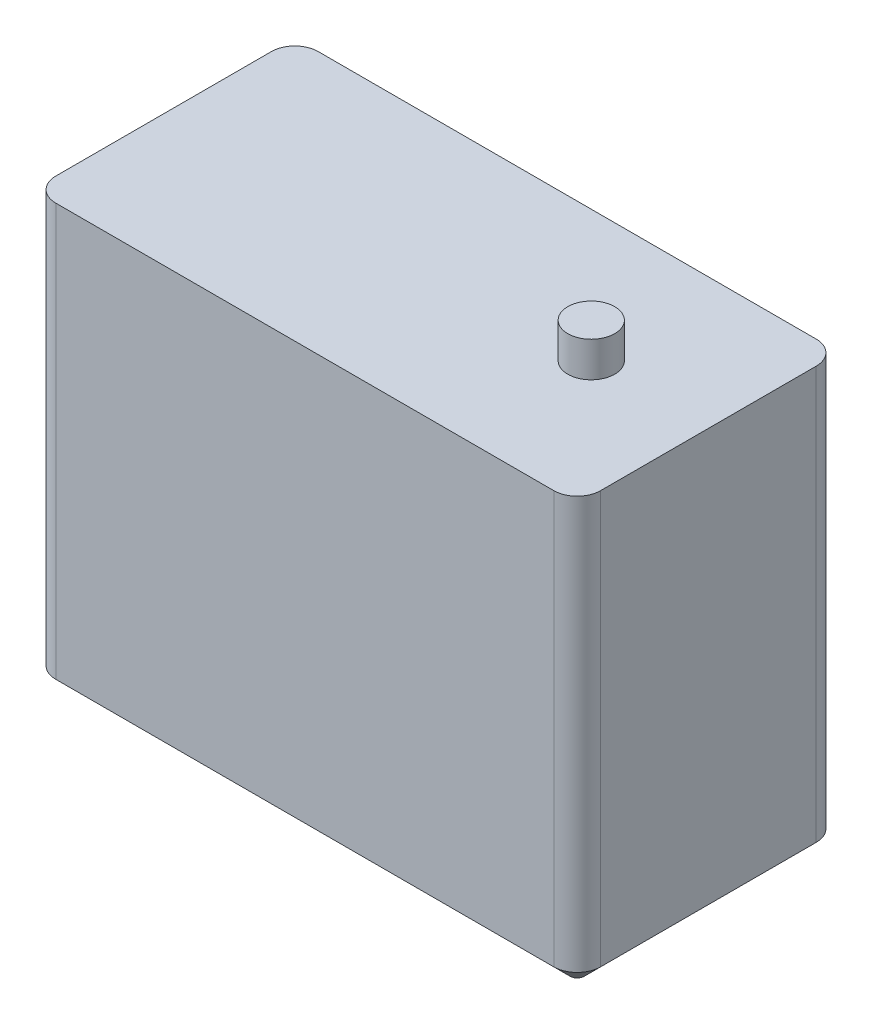
ISO-10303-21;
HEADER;
FILE_DESCRIPTION(('STEP AP214'),'2;1');
FILE_NAME('part.step','',(''),(''),'','','');
FILE_SCHEMA(('AUTOMOTIVE_DESIGN { 1 0 10303 214 1 1 1 1 }'));
ENDSEC;
DATA;
#1=APPLICATION_CONTEXT('core data for automotive mechanical design processes');
#2=APPLICATION_PROTOCOL_DEFINITION('international standard','automotive_design',2000,#1);
#3=PRODUCT_CONTEXT('',#1,'mechanical');
#4=PRODUCT('Part','Part','',(#3));
#5=PRODUCT_RELATED_PRODUCT_CATEGORY('part','',(#4));
#6=PRODUCT_DEFINITION_FORMATION('','',#4);
#7=PRODUCT_DEFINITION_CONTEXT('part definition',#1,'design');
#8=PRODUCT_DEFINITION('design','',#6,#7);
#9=PRODUCT_DEFINITION_SHAPE('','',#8);
#10=(LENGTH_UNIT() NAMED_UNIT(*) SI_UNIT(.MILLI.,.METRE.));
#11=(NAMED_UNIT(*) PLANE_ANGLE_UNIT() SI_UNIT($,.RADIAN.));
#12=(NAMED_UNIT(*) SI_UNIT($,.STERADIAN.) SOLID_ANGLE_UNIT());
#13=UNCERTAINTY_MEASURE_WITH_UNIT(LENGTH_MEASURE(1.E-05),#10,'distance_accuracy_value','');
#14=(GEOMETRIC_REPRESENTATION_CONTEXT(3) GLOBAL_UNCERTAINTY_ASSIGNED_CONTEXT((#13)) GLOBAL_UNIT_ASSIGNED_CONTEXT((#10,
#11,#12)) REPRESENTATION_CONTEXT('',''));
#15=CARTESIAN_POINT('',(0.,0.,0.));
#16=DIRECTION('',(0.,0.,1.));
#17=DIRECTION('',(1.,0.,0.));
#18=AXIS2_PLACEMENT_3D('',#15,#16,#17);
#19=CARTESIAN_POINT('',(0.,46.482,0.));
#20=DIRECTION('',(0.,-1.,0.));
#21=DIRECTION('',(0.,0.,-1.));
#22=AXIS2_PLACEMENT_3D('',#19,#20,#21);
#23=PLANE('',#22);
#24=DIRECTION('',(-1.,0.,0.));
#25=VECTOR('',#24,1.);
#26=CARTESIAN_POINT('',(-31.8715115525379,46.482,-4.46509543107518));
#27=LINE('',#26,#25);
#28=CARTESIAN_POINT('',(24.6434884474621,46.482,-4.46509543107518));
#29=VERTEX_POINT('',#28);
#30=CARTESIAN_POINT('',(-29.3315115525379,46.482,-4.46509543107518));
#31=VERTEX_POINT('',#30);
#32=EDGE_CURVE('E131',#29,#31,#27,.T.);
#33=ORIENTED_EDGE('',*,*,#32,.T.);
#34=CARTESIAN_POINT('',(-29.3315115525379,46.482,-1.92509543107518));
#35=DIRECTION('',(0.,-1.,0.));
#36=DIRECTION('',(0.,0.,-1.));
#37=AXIS2_PLACEMENT_3D('',#34,#35,#36);
#38=CIRCLE('',#37,2.54);
#39=CARTESIAN_POINT('',(-31.8715115525379,46.482,-1.92509543107518));
#40=VERTEX_POINT('',#39);
#41=EDGE_CURVE('E125',#31,#40,#38,.F.);
#42=ORIENTED_EDGE('',*,*,#41,.T.);
#43=DIRECTION('',(0.,0.,1.));
#44=VECTOR('',#43,1.);
#45=CARTESIAN_POINT('',(-31.8715115525379,46.482,23.9829045689248));
#46=LINE('',#45,#44);
#47=CARTESIAN_POINT('',(-31.8715115525379,46.482,21.4429045689248));
#48=VERTEX_POINT('',#47);
#49=EDGE_CURVE('E128',#40,#48,#46,.T.);
#50=ORIENTED_EDGE('',*,*,#49,.T.);
#51=CARTESIAN_POINT('',(-29.3315115525379,46.482,21.4429045689248));
#52=DIRECTION('',(0.,-1.,0.));
#53=DIRECTION('',(0.,0.,-1.));
#54=AXIS2_PLACEMENT_3D('',#51,#52,#53);
#55=CIRCLE('',#54,2.54);
#56=CARTESIAN_POINT('',(-29.3315115525379,46.482,23.9829045689248));
#57=VERTEX_POINT('',#56);
#58=EDGE_CURVE('E161',#48,#57,#55,.F.);
#59=ORIENTED_EDGE('',*,*,#58,.T.);
#60=DIRECTION('',(1.,0.,0.));
#61=VECTOR('',#60,1.);
#62=CARTESIAN_POINT('',(-31.8715115525379,46.482,23.9829045689248));
#63=LINE('',#62,#61);
#64=CARTESIAN_POINT('',(24.6434884474621,46.482,23.9829045689248));
#65=VERTEX_POINT('',#64);
#66=EDGE_CURVE('E144',#57,#65,#63,.T.);
#67=ORIENTED_EDGE('',*,*,#66,.T.);
#68=CARTESIAN_POINT('',(24.6434884474621,46.482,21.4429045689248));
#69=DIRECTION('',(0.,-1.,0.));
#70=DIRECTION('',(0.,0.,-1.));
#71=AXIS2_PLACEMENT_3D('',#68,#69,#70);
#72=CIRCLE('',#71,2.54);
#73=CARTESIAN_POINT('',(27.1834884474621,46.482,21.4429045689248));
#74=VERTEX_POINT('',#73);
#75=EDGE_CURVE('E163',#65,#74,#72,.F.);
#76=ORIENTED_EDGE('',*,*,#75,.T.);
#77=DIRECTION('',(0.,0.,-1.));
#78=VECTOR('',#77,1.);
#79=CARTESIAN_POINT('',(27.1834884474621,46.482,23.9829045689248));
#80=LINE('',#79,#78);
#81=CARTESIAN_POINT('',(27.1834884474621,46.482,-1.92509543107518));
#82=VERTEX_POINT('',#81);
#83=EDGE_CURVE('E233',#74,#82,#80,.T.);
#84=ORIENTED_EDGE('',*,*,#83,.T.);
#85=CARTESIAN_POINT('',(24.6434884474621,46.482,-1.92509543107518));
#86=DIRECTION('',(0.,-1.,0.));
#87=DIRECTION('',(0.,0.,-1.));
#88=AXIS2_PLACEMENT_3D('',#85,#86,#87);
#89=CIRCLE('',#88,2.54);
#90=EDGE_CURVE('E136',#82,#29,#89,.F.);
#91=ORIENTED_EDGE('',*,*,#90,.T.);
#92=EDGE_LOOP('',(#33,#42,#50,#59,#67,#76,#84,#91));
#93=FACE_BOUND('',#92,.T.);
#94=CARTESIAN_POINT('',(14.4834884474621,46.482,9.75890456892482));
#95=DIRECTION('',(0.,-1.,0.));
#96=DIRECTION('',(0.,0.,-1.));
#97=AXIS2_PLACEMENT_3D('',#94,#95,#96);
#98=CIRCLE('',#97,2.54);
#99=CARTESIAN_POINT('',(14.4834884474621,46.482,7.21890456892483));
#100=VERTEX_POINT('',#99);
#101=EDGE_CURVE('E156',#100,#100,#98,.F.);
#102=ORIENTED_EDGE('',*,*,#101,.F.);
#103=EDGE_LOOP('',(#102));
#104=FACE_BOUND('',#103,.T.);
#105=ADVANCED_FACE('F33',(#93,#104),#23,.F.);
#106=CARTESIAN_POINT('',(-31.8715115525379,46.482,23.9829045689248));
#107=DIRECTION('',(1.,0.,0.));
#108=DIRECTION('',(0.,0.,-1.));
#109=AXIS2_PLACEMENT_3D('',#106,#107,#108);
#110=PLANE('',#109);
#111=DIRECTION('',(0.,-1.,0.));
#112=VECTOR('',#111,1.);
#113=CARTESIAN_POINT('',(-31.8715115525379,46.482,-1.92509543107518));
#114=LINE('',#113,#112);
#115=CARTESIAN_POINT('',(-31.8715115525379,1.778,-1.92509543107518));
#116=VERTEX_POINT('',#115);
#117=EDGE_CURVE('E141',#40,#116,#114,.T.);
#118=ORIENTED_EDGE('',*,*,#117,.T.);
#119=DIRECTION('',(0.,0.,1.));
#120=VECTOR('',#119,1.);
#121=CARTESIAN_POINT('',(-31.8715115525379,1.778,21.4429045689248));
#122=LINE('',#121,#120);
#123=CARTESIAN_POINT('',(-31.8715115525379,1.778,21.4429045689248));
#124=VERTEX_POINT('',#123);
#125=EDGE_CURVE('E195',#116,#124,#122,.T.);
#126=ORIENTED_EDGE('',*,*,#125,.T.);
#127=DIRECTION('',(0.,-1.,0.));
#128=VECTOR('',#127,1.);
#129=CARTESIAN_POINT('',(-31.8715115525379,46.482,21.4429045689248));
#130=LINE('',#129,#128);
#131=EDGE_CURVE('E143',#124,#48,#130,.F.);
#132=ORIENTED_EDGE('',*,*,#131,.T.);
#133=ORIENTED_EDGE('',*,*,#49,.F.);
#134=EDGE_LOOP('',(#118,#126,#132,#133));
#135=FACE_BOUND('',#134,.T.);
#136=ADVANCED_FACE('F140',(#135),#110,.F.);
#137=CARTESIAN_POINT('',(-31.8715115525379,46.482,23.9829045689248));
#138=DIRECTION('',(0.,0.,-1.));
#139=DIRECTION('',(-1.,0.,0.));
#140=AXIS2_PLACEMENT_3D('',#137,#138,#139);
#141=PLANE('',#140);
#142=DIRECTION('',(0.,-1.,0.));
#143=VECTOR('',#142,1.);
#144=CARTESIAN_POINT('',(-29.3315115525379,46.482,23.9829045689248));
#145=LINE('',#144,#143);
#146=CARTESIAN_POINT('',(-29.3315115525379,1.778,23.9829045689248));
#147=VERTEX_POINT('',#146);
#148=EDGE_CURVE('E169',#57,#147,#145,.T.);
#149=ORIENTED_EDGE('',*,*,#148,.T.);
#150=DIRECTION('',(1.,0.,0.));
#151=VECTOR('',#150,1.);
#152=CARTESIAN_POINT('',(24.6434884474621,1.778,23.9829045689248));
#153=LINE('',#152,#151);
#154=CARTESIAN_POINT('',(24.6434884474621,1.778,23.9829045689248));
#155=VERTEX_POINT('',#154);
#156=EDGE_CURVE('E57',#147,#155,#153,.T.);
#157=ORIENTED_EDGE('',*,*,#156,.T.);
#158=DIRECTION('',(0.,-1.,0.));
#159=VECTOR('',#158,1.);
#160=CARTESIAN_POINT('',(24.6434884474621,46.482,23.9829045689248));
#161=LINE('',#160,#159);
#162=EDGE_CURVE('E171',#155,#65,#161,.F.);
#163=ORIENTED_EDGE('',*,*,#162,.T.);
#164=ORIENTED_EDGE('',*,*,#66,.F.);
#165=EDGE_LOOP('',(#149,#157,#163,#164));
#166=FACE_BOUND('',#165,.T.);
#167=ADVANCED_FACE('F245',(#166),#141,.F.);
#168=CARTESIAN_POINT('',(27.1834884474621,46.482,23.9829045689248));
#169=DIRECTION('',(-1.,0.,0.));
#170=DIRECTION('',(0.,0.,1.));
#171=AXIS2_PLACEMENT_3D('',#168,#169,#170);
#172=PLANE('',#171);
#173=DIRECTION('',(0.,-1.,0.));
#174=VECTOR('',#173,1.);
#175=CARTESIAN_POINT('',(27.1834884474621,46.482,21.4429045689248));
#176=LINE('',#175,#174);
#177=CARTESIAN_POINT('',(27.1834884474621,1.778,21.4429045689248));
#178=VERTEX_POINT('',#177);
#179=EDGE_CURVE('E135',#74,#178,#176,.T.);
#180=ORIENTED_EDGE('',*,*,#179,.T.);
#181=DIRECTION('',(0.,0.,-1.));
#182=VECTOR('',#181,1.);
#183=CARTESIAN_POINT('',(27.1834884474621,1.778,-1.92509543107518));
#184=LINE('',#183,#182);
#185=CARTESIAN_POINT('',(27.1834884474621,1.778,-1.92509543107518));
#186=VERTEX_POINT('',#185);
#187=EDGE_CURVE('E11',#178,#186,#184,.T.);
#188=ORIENTED_EDGE('',*,*,#187,.T.);
#189=DIRECTION('',(0.,-1.,0.));
#190=VECTOR('',#189,1.);
#191=CARTESIAN_POINT('',(27.1834884474621,46.482,-1.92509543107518));
#192=LINE('',#191,#190);
#193=EDGE_CURVE('E167',#186,#82,#192,.F.);
#194=ORIENTED_EDGE('',*,*,#193,.T.);
#195=ORIENTED_EDGE('',*,*,#83,.F.);
#196=EDGE_LOOP('',(#180,#188,#194,#195));
#197=FACE_BOUND('',#196,.T.);
#198=ADVANCED_FACE('F257',(#197),#172,.F.);
#199=CARTESIAN_POINT('',(-31.8715115525379,46.482,-4.46509543107518));
#200=DIRECTION('',(0.,0.,1.));
#201=DIRECTION('',(1.,0.,0.));
#202=AXIS2_PLACEMENT_3D('',#199,#200,#201);
#203=PLANE('',#202);
#204=DIRECTION('',(0.,-1.,0.));
#205=VECTOR('',#204,1.);
#206=CARTESIAN_POINT('',(24.6434884474621,46.482,-4.46509543107518));
#207=LINE('',#206,#205);
#208=CARTESIAN_POINT('',(24.6434884474621,1.778,-4.46509543107518));
#209=VERTEX_POINT('',#208);
#210=EDGE_CURVE('E151',#29,#209,#207,.T.);
#211=ORIENTED_EDGE('',*,*,#210,.T.);
#212=DIRECTION('',(-1.,0.,0.));
#213=VECTOR('',#212,1.);
#214=CARTESIAN_POINT('',(-29.3315115525379,1.778,-4.46509543107518));
#215=LINE('',#214,#213);
#216=CARTESIAN_POINT('',(-29.3315115525379,1.778,-4.46509543107518));
#217=VERTEX_POINT('',#216);
#218=EDGE_CURVE('E191',#209,#217,#215,.T.);
#219=ORIENTED_EDGE('',*,*,#218,.T.);
#220=DIRECTION('',(0.,-1.,0.));
#221=VECTOR('',#220,1.);
#222=CARTESIAN_POINT('',(-29.3315115525379,46.482,-4.46509543107518));
#223=LINE('',#222,#221);
#224=EDGE_CURVE('E154',#217,#31,#223,.F.);
#225=ORIENTED_EDGE('',*,*,#224,.T.);
#226=ORIENTED_EDGE('',*,*,#32,.F.);
#227=EDGE_LOOP('',(#211,#219,#225,#226));
#228=FACE_BOUND('',#227,.T.);
#229=ADVANCED_FACE('F253',(#228),#203,.F.);
#230=CARTESIAN_POINT('',(0.,0.,0.));
#231=DIRECTION('',(0.,-1.,0.));
#232=DIRECTION('',(0.,0.,-1.));
#233=AXIS2_PLACEMENT_3D('',#230,#231,#232);
#234=PLANE('',#233);
#235=DIRECTION('',(0.,0.,-1.));
#236=VECTOR('',#235,1.);
#237=CARTESIAN_POINT('',(-30.0935115525379,0.,-1.92509543107518));
#238=LINE('',#237,#236);
#239=CARTESIAN_POINT('',(-30.0935115525379,0.,21.4429045689248));
#240=VERTEX_POINT('',#239);
#241=CARTESIAN_POINT('',(-30.0935115525379,0.,-1.92509543107518));
#242=VERTEX_POINT('',#241);
#243=EDGE_CURVE('E181',#240,#242,#238,.T.);
#244=ORIENTED_EDGE('',*,*,#243,.T.);
#245=CARTESIAN_POINT('',(-29.3315115525379,0.,-1.92509543107518));
#246=DIRECTION('',(0.,-1.,0.));
#247=DIRECTION('',(0.,0.,-1.));
#248=AXIS2_PLACEMENT_3D('',#245,#246,#247);
#249=CIRCLE('',#248,0.761999999999992);
#250=CARTESIAN_POINT('',(-29.3315115525379,0.,-2.68709543107517));
#251=VERTEX_POINT('',#250);
#252=EDGE_CURVE('E187',#242,#251,#249,.T.);
#253=ORIENTED_EDGE('',*,*,#252,.T.);
#254=DIRECTION('',(1.,0.,0.));
#255=VECTOR('',#254,1.);
#256=CARTESIAN_POINT('',(24.6434884474621,0.,-2.68709543107517));
#257=LINE('',#256,#255);
#258=CARTESIAN_POINT('',(24.6434884474621,0.,-2.68709543107517));
#259=VERTEX_POINT('',#258);
#260=EDGE_CURVE('E185',#251,#259,#257,.T.);
#261=ORIENTED_EDGE('',*,*,#260,.T.);
#262=CARTESIAN_POINT('',(24.6434884474621,0.,-1.92509543107518));
#263=DIRECTION('',(0.,-1.,0.));
#264=DIRECTION('',(0.,0.,-1.));
#265=AXIS2_PLACEMENT_3D('',#262,#263,#264);
#266=CIRCLE('',#265,0.761999999999992);
#267=CARTESIAN_POINT('',(25.4054884474621,0.,-1.92509543107518));
#268=VERTEX_POINT('',#267);
#269=EDGE_CURVE('E183',#259,#268,#266,.T.);
#270=ORIENTED_EDGE('',*,*,#269,.T.);
#271=DIRECTION('',(0.,0.,1.));
#272=VECTOR('',#271,1.);
#273=CARTESIAN_POINT('',(25.4054884474621,0.,21.4429045689248));
#274=LINE('',#273,#272);
#275=CARTESIAN_POINT('',(25.4054884474621,0.,21.4429045689248));
#276=VERTEX_POINT('',#275);
#277=EDGE_CURVE('E173',#268,#276,#274,.T.);
#278=ORIENTED_EDGE('',*,*,#277,.T.);
#279=CARTESIAN_POINT('',(24.6434884474621,0.,21.4429045689248));
#280=DIRECTION('',(0.,-1.,0.));
#281=DIRECTION('',(0.,0.,-1.));
#282=AXIS2_PLACEMENT_3D('',#279,#280,#281);
#283=CIRCLE('',#282,0.761999999999992);
#284=CARTESIAN_POINT('',(24.6434884474621,0.,22.2049045689248));
#285=VERTEX_POINT('',#284);
#286=EDGE_CURVE('E175',#276,#285,#283,.T.);
#287=ORIENTED_EDGE('',*,*,#286,.T.);
#288=DIRECTION('',(-1.,0.,0.));
#289=VECTOR('',#288,1.);
#290=CARTESIAN_POINT('',(-29.3315115525379,0.,22.2049045689248));
#291=LINE('',#290,#289);
#292=CARTESIAN_POINT('',(-29.3315115525379,0.,22.2049045689248));
#293=VERTEX_POINT('',#292);
#294=EDGE_CURVE('E177',#285,#293,#291,.T.);
#295=ORIENTED_EDGE('',*,*,#294,.T.);
#296=CARTESIAN_POINT('',(-29.3315115525379,0.,21.4429045689248));
#297=DIRECTION('',(0.,-1.,0.));
#298=DIRECTION('',(0.,0.,-1.));
#299=AXIS2_PLACEMENT_3D('',#296,#297,#298);
#300=CIRCLE('',#299,0.761999999999992);
#301=EDGE_CURVE('E179',#293,#240,#300,.T.);
#302=ORIENTED_EDGE('',*,*,#301,.T.);
#303=EDGE_LOOP('',(#244,#253,#261,#270,#278,#287,#295,#302));
#304=FACE_BOUND('',#303,.T.);
#305=ADVANCED_FACE('F250',(#304),#234,.T.);
#306=CARTESIAN_POINT('',(14.4834884474621,50.292,9.75890456892482));
#307=DIRECTION('',(0.,-1.,0.));
#308=DIRECTION('',(0.,0.,-1.));
#309=AXIS2_PLACEMENT_3D('',#306,#307,#308);
#310=CYLINDRICAL_SURFACE('',#309,2.54);
#311=CARTESIAN_POINT('',(14.4834884474621,50.292,9.75890456892482));
#312=DIRECTION('',(0.,1.,0.));
#313=DIRECTION('',(0.,0.,1.));
#314=AXIS2_PLACEMENT_3D('',#311,#312,#313);
#315=CIRCLE('',#314,2.54);
#316=CARTESIAN_POINT('',(14.4834884474621,50.292,7.21890456892483));
#317=VERTEX_POINT('',#316);
#318=EDGE_CURVE('E145',#317,#317,#315,.T.);
#319=CARTESIAN_POINT('',(14.4834884474621,50.292,7.21890456892483));
#320=CARTESIAN_POINT('',(14.4834884474621,50.2523125,7.21890456892483));
#321=CARTESIAN_POINT('',(14.4834884474621,50.212625,7.21890456892483));
#322=CARTESIAN_POINT('',(14.4834884474621,50.13325,7.21890456892483));
#323=CARTESIAN_POINT('',(14.4834884474621,50.0935625,7.21890456892483));
#324=CARTESIAN_POINT('',(14.4834884474621,50.0141875,7.21890456892483));
#325=CARTESIAN_POINT('',(14.4834884474621,49.9745,7.21890456892483));
#326=CARTESIAN_POINT('',(14.4834884474621,49.895125,7.21890456892483));
#327=CARTESIAN_POINT('',(14.4834884474621,49.8554375,7.21890456892483));
#328=CARTESIAN_POINT('',(14.4834884474621,49.7760625,7.21890456892483));
#329=CARTESIAN_POINT('',(14.4834884474621,49.736375,7.21890456892483));
#330=CARTESIAN_POINT('',(14.4834884474621,49.657,7.21890456892483));
#331=CARTESIAN_POINT('',(14.4834884474621,49.6173125,7.21890456892483));
#332=CARTESIAN_POINT('',(14.4834884474621,49.5379375,7.21890456892483));
#333=CARTESIAN_POINT('',(14.4834884474621,49.49825,7.21890456892483));
#334=CARTESIAN_POINT('',(14.4834884474621,49.418875,7.21890456892483));
#335=CARTESIAN_POINT('',(14.4834884474621,49.3791875,7.21890456892483));
#336=CARTESIAN_POINT('',(14.4834884474621,49.2998125,7.21890456892483));
#337=CARTESIAN_POINT('',(14.4834884474621,49.260125,7.21890456892483));
#338=CARTESIAN_POINT('',(14.4834884474621,49.18075,7.21890456892483));
#339=CARTESIAN_POINT('',(14.4834884474621,49.1410625,7.21890456892483));
#340=CARTESIAN_POINT('',(14.4834884474621,49.0616875,7.21890456892483));
#341=CARTESIAN_POINT('',(14.4834884474621,49.022,7.21890456892483));
#342=CARTESIAN_POINT('',(14.4834884474621,48.942625,7.21890456892483));
#343=CARTESIAN_POINT('',(14.4834884474621,48.9029375,7.21890456892483));
#344=CARTESIAN_POINT('',(14.4834884474621,48.8235625,7.21890456892483));
#345=CARTESIAN_POINT('',(14.4834884474621,48.783875,7.21890456892483));
#346=CARTESIAN_POINT('',(14.4834884474621,48.7045,7.21890456892483));
#347=CARTESIAN_POINT('',(14.4834884474621,48.6648125,7.21890456892483));
#348=CARTESIAN_POINT('',(14.4834884474621,48.5854375,7.21890456892483));
#349=CARTESIAN_POINT('',(14.4834884474621,48.54575,7.21890456892483));
#350=CARTESIAN_POINT('',(14.4834884474621,48.466375,7.21890456892483));
#351=CARTESIAN_POINT('',(14.4834884474621,48.4266875,7.21890456892483));
#352=CARTESIAN_POINT('',(14.4834884474621,48.3473125,7.21890456892483));
#353=CARTESIAN_POINT('',(14.4834884474621,48.307625,7.21890456892483));
#354=CARTESIAN_POINT('',(14.4834884474621,48.22825,7.21890456892483));
#355=CARTESIAN_POINT('',(14.4834884474621,48.1885625,7.21890456892483));
#356=CARTESIAN_POINT('',(14.4834884474621,48.1091875,7.21890456892483));
#357=CARTESIAN_POINT('',(14.4834884474621,48.0695,7.21890456892483));
#358=CARTESIAN_POINT('',(14.4834884474621,47.990125,7.21890456892483));
#359=CARTESIAN_POINT('',(14.4834884474621,47.9504375,7.21890456892483));
#360=CARTESIAN_POINT('',(14.4834884474621,47.8710625,7.21890456892483));
#361=CARTESIAN_POINT('',(14.4834884474621,47.831375,7.21890456892483));
#362=CARTESIAN_POINT('',(14.4834884474621,47.752,7.21890456892483));
#363=CARTESIAN_POINT('',(14.4834884474621,47.7123125,7.21890456892483));
#364=CARTESIAN_POINT('',(14.4834884474621,47.6329375,7.21890456892483));
#365=CARTESIAN_POINT('',(14.4834884474621,47.59325,7.21890456892483));
#366=CARTESIAN_POINT('',(14.4834884474621,47.513875,7.21890456892483));
#367=CARTESIAN_POINT('',(14.4834884474621,47.4741875,7.21890456892483));
#368=CARTESIAN_POINT('',(14.4834884474621,47.3948125,7.21890456892483));
#369=CARTESIAN_POINT('',(14.4834884474621,47.355125,7.21890456892483));
#370=CARTESIAN_POINT('',(14.4834884474621,47.27575,7.21890456892483));
#371=CARTESIAN_POINT('',(14.4834884474621,47.2360625,7.21890456892483));
#372=CARTESIAN_POINT('',(14.4834884474621,47.1566875,7.21890456892483));
#373=CARTESIAN_POINT('',(14.4834884474621,47.117,7.21890456892483));
#374=CARTESIAN_POINT('',(14.4834884474621,47.037625,7.21890456892483));
#375=CARTESIAN_POINT('',(14.4834884474621,46.9979375,7.21890456892483));
#376=CARTESIAN_POINT('',(14.4834884474621,46.9185625,7.21890456892483));
#377=CARTESIAN_POINT('',(14.4834884474621,46.878875,7.21890456892483));
#378=CARTESIAN_POINT('',(14.4834884474621,46.7995,7.21890456892483));
#379=CARTESIAN_POINT('',(14.4834884474621,46.7598125,7.21890456892483));
#380=CARTESIAN_POINT('',(14.4834884474621,46.6804375,7.21890456892483));
#381=CARTESIAN_POINT('',(14.4834884474621,46.64075,7.21890456892483));
#382=CARTESIAN_POINT('',(14.4834884474621,46.561375,7.21890456892483));
#383=CARTESIAN_POINT('',(14.4834884474621,46.5216875,7.21890456892483));
#384=CARTESIAN_POINT('',(14.4834884474621,46.482,7.21890456892483));
#385=B_SPLINE_CURVE_WITH_KNOTS('',3,(#319,#320,#321,#322,#323,#324,#325,#326,#327,#328,#329,
#330,#331,#332,#333,#334,#335,#336,#337,#338,#339,#340,#341,#342,#343,#344,#345,#346,#347,#348,
#349,#350,#351,#352,#353,#354,#355,#356,#357,#358,#359,#360,#361,#362,#363,#364,#365,#366,#367,
#368,#369,#370,#371,#372,#373,#374,#375,#376,#377,#378,#379,#380,#381,#382,#383,#384),
.UNSPECIFIED.,.F.,.F.,(4,2,2,2,2,2,2,2,2,2,2,2,2,2,2,2,2,2,2,2,2,2,2,2,2,2,2,2,2,2,2,2,4),(0.,
0.119062499999996,0.238124999999999,0.357187499999995,0.476249999999998,0.595312499999993,
0.714374999999996,0.833437499999992,0.952499999999995,1.0715625,1.19062499999999,1.3096875,
1.42874999999999,1.5478125,1.66687499999999,1.78593749999999,1.905,2.02406249999999,2.143125,
2.26218749999999,2.38124999999999,2.50031249999999,2.61937499999999,2.73843749999999,
2.85749999999999,2.97656249999999,3.09562499999999,3.21468749999999,3.33374999999999,
3.45281249999999,3.57187499999999,3.69093749999999,3.80999999999999),.UNSPECIFIED.);
#386=EDGE_CURVE('BSEAM239',#317,#100,#385,.T.);
#387=ORIENTED_EDGE('',*,*,#318,.F.);
#388=ORIENTED_EDGE('',*,*,#101,.T.);
#389=ORIENTED_EDGE('',*,*,#386,.T.);
#390=ORIENTED_EDGE('',*,*,#386,.F.);
#391=EDGE_LOOP('',(#387,#389,#388,#390));
#392=FACE_BOUND('',#391,.T.);
#393=ADVANCED_FACE('F239',(#392),#310,.T.);
#394=CARTESIAN_POINT('',(0.,50.292,0.));
#395=DIRECTION('',(0.,1.,0.));
#396=DIRECTION('',(0.,0.,1.));
#397=AXIS2_PLACEMENT_3D('',#394,#395,#396);
#398=PLANE('',#397);
#399=ORIENTED_EDGE('',*,*,#318,.T.);
#400=EDGE_LOOP('',(#399));
#401=FACE_BOUND('',#400,.T.);
#402=ADVANCED_FACE('F267',(#401),#398,.T.);
#403=CARTESIAN_POINT('',(-29.3315115525379,46.482,-1.92509543107518));
#404=DIRECTION('',(0.,-1.,0.));
#405=DIRECTION('',(0.,0.,-1.));
#406=AXIS2_PLACEMENT_3D('',#403,#404,#405);
#407=CYLINDRICAL_SURFACE('',#406,2.54);
#408=ORIENTED_EDGE('',*,*,#224,.F.);
#409=CARTESIAN_POINT('',(-29.3315115525379,1.778,-1.92509543107518));
#410=DIRECTION('',(0.,-1.,0.));
#411=DIRECTION('',(0.,0.,-1.));
#412=AXIS2_PLACEMENT_3D('',#409,#410,#411);
#413=CIRCLE('',#412,2.54);
#414=EDGE_CURVE('E150',#217,#116,#413,.F.);
#415=ORIENTED_EDGE('',*,*,#414,.T.);
#416=ORIENTED_EDGE('',*,*,#117,.F.);
#417=ORIENTED_EDGE('',*,*,#41,.F.);
#418=EDGE_LOOP('',(#408,#415,#416,#417));
#419=FACE_BOUND('',#418,.T.);
#420=ADVANCED_FACE('F148',(#419),#407,.T.);
#421=CARTESIAN_POINT('',(24.6434884474621,46.482,-1.92509543107518));
#422=DIRECTION('',(0.,-1.,0.));
#423=DIRECTION('',(0.,0.,-1.));
#424=AXIS2_PLACEMENT_3D('',#421,#422,#423);
#425=CYLINDRICAL_SURFACE('',#424,2.54);
#426=ORIENTED_EDGE('',*,*,#193,.F.);
#427=CARTESIAN_POINT('',(24.6434884474621,1.778,-1.92509543107518));
#428=DIRECTION('',(0.,-1.,0.));
#429=DIRECTION('',(0.,0.,-1.));
#430=AXIS2_PLACEMENT_3D('',#427,#428,#429);
#431=CIRCLE('',#430,2.54);
#432=EDGE_CURVE('E193',#186,#209,#431,.F.);
#433=ORIENTED_EDGE('',*,*,#432,.T.);
#434=ORIENTED_EDGE('',*,*,#210,.F.);
#435=ORIENTED_EDGE('',*,*,#90,.F.);
#436=EDGE_LOOP('',(#426,#433,#434,#435));
#437=FACE_BOUND('',#436,.T.);
#438=ADVANCED_FACE('F266',(#437),#425,.T.);
#439=CARTESIAN_POINT('',(24.6434884474621,46.482,21.4429045689248));
#440=DIRECTION('',(0.,-1.,0.));
#441=DIRECTION('',(0.,0.,-1.));
#442=AXIS2_PLACEMENT_3D('',#439,#440,#441);
#443=CYLINDRICAL_SURFACE('',#442,2.54);
#444=ORIENTED_EDGE('',*,*,#162,.F.);
#445=CARTESIAN_POINT('',(24.6434884474621,1.778,21.4429045689248));
#446=DIRECTION('',(0.,-1.,0.));
#447=DIRECTION('',(0.,0.,-1.));
#448=AXIS2_PLACEMENT_3D('',#445,#446,#447);
#449=CIRCLE('',#448,2.54);
#450=EDGE_CURVE('E42',#155,#178,#449,.F.);
#451=ORIENTED_EDGE('',*,*,#450,.T.);
#452=ORIENTED_EDGE('',*,*,#179,.F.);
#453=ORIENTED_EDGE('',*,*,#75,.F.);
#454=EDGE_LOOP('',(#444,#451,#452,#453));
#455=FACE_BOUND('',#454,.T.);
#456=ADVANCED_FACE('F270',(#455),#443,.T.);
#457=CARTESIAN_POINT('',(-29.3315115525379,46.482,21.4429045689248));
#458=DIRECTION('',(0.,-1.,0.));
#459=DIRECTION('',(0.,0.,-1.));
#460=AXIS2_PLACEMENT_3D('',#457,#458,#459);
#461=CYLINDRICAL_SURFACE('',#460,2.54);
#462=ORIENTED_EDGE('',*,*,#131,.F.);
#463=CARTESIAN_POINT('',(-29.3315115525379,1.778,21.4429045689248));
#464=DIRECTION('',(0.,-1.,0.));
#465=DIRECTION('',(0.,0.,-1.));
#466=AXIS2_PLACEMENT_3D('',#463,#464,#465);
#467=CIRCLE('',#466,2.54);
#468=EDGE_CURVE('E197',#124,#147,#467,.F.);
#469=ORIENTED_EDGE('',*,*,#468,.T.);
#470=ORIENTED_EDGE('',*,*,#148,.F.);
#471=ORIENTED_EDGE('',*,*,#58,.F.);
#472=EDGE_LOOP('',(#462,#469,#470,#471));
#473=FACE_BOUND('',#472,.T.);
#474=ADVANCED_FACE('F274',(#473),#461,.T.);
#475=CARTESIAN_POINT('',(24.6434884474621,0.,21.4429045689248));
#476=DIRECTION('',(0.,1.,0.));
#477=DIRECTION('',(0.,0.,1.));
#478=AXIS2_PLACEMENT_3D('',#475,#476,#477);
#479=CONICAL_SURFACE('',#478,0.761999999999992,0.78539816339745);
#480=DIRECTION('',(-0.707106781186549,-0.707106781186546,0.));
#481=VECTOR('',#480,1.);
#482=CARTESIAN_POINT('',(27.1834884474621,1.778,21.4429045689248));
#483=LINE('',#482,#481);
#484=EDGE_CURVE('E216',#178,#276,#483,.T.);
#485=ORIENTED_EDGE('',*,*,#484,.F.);
#486=ORIENTED_EDGE('',*,*,#450,.F.);
#487=DIRECTION('',(0.,0.707106781186546,0.707106781186549));
#488=VECTOR('',#487,1.);
#489=CARTESIAN_POINT('',(24.6434884474621,0.,22.2049045689248));
#490=LINE('',#489,#488);
#491=EDGE_CURVE('E37',#285,#155,#490,.T.);
#492=ORIENTED_EDGE('',*,*,#491,.F.);
#493=ORIENTED_EDGE('',*,*,#286,.F.);
#494=EDGE_LOOP('',(#485,#486,#492,#493));
#495=FACE_BOUND('',#494,.T.);
#496=ADVANCED_FACE('F35',(#495),#479,.T.);
#497=CARTESIAN_POINT('',(-31.8715115525379,1.778,23.9829045689248));
#498=DIRECTION('',(0.,-0.707106781186549,0.707106781186546));
#499=DIRECTION('',(-1.,0.,0.));
#500=AXIS2_PLACEMENT_3D('',#497,#498,#499);
#501=PLANE('',#500);
#502=ORIENTED_EDGE('',*,*,#491,.T.);
#503=ORIENTED_EDGE('',*,*,#156,.F.);
#504=DIRECTION('',(0.,0.707106781186546,0.707106781186549));
#505=VECTOR('',#504,1.);
#506=CARTESIAN_POINT('',(-29.3315115525379,0.,22.2049045689248));
#507=LINE('',#506,#505);
#508=EDGE_CURVE('E214',#293,#147,#507,.T.);
#509=ORIENTED_EDGE('',*,*,#508,.F.);
#510=ORIENTED_EDGE('',*,*,#294,.F.);
#511=EDGE_LOOP('',(#502,#503,#509,#510));
#512=FACE_BOUND('',#511,.T.);
#513=ADVANCED_FACE('F300',(#512),#501,.T.);
#514=CARTESIAN_POINT('',(27.1834884474621,1.778,23.9829045689248));
#515=DIRECTION('',(0.707106781186546,-0.707106781186549,0.));
#516=DIRECTION('',(0.,0.,1.));
#517=AXIS2_PLACEMENT_3D('',#514,#515,#516);
#518=PLANE('',#517);
#519=ORIENTED_EDGE('',*,*,#484,.T.);
#520=ORIENTED_EDGE('',*,*,#277,.F.);
#521=DIRECTION('',(-0.707106781186549,-0.707106781186546,0.));
#522=VECTOR('',#521,1.);
#523=CARTESIAN_POINT('',(27.1834884474621,1.778,-1.92509543107518));
#524=LINE('',#523,#522);
#525=EDGE_CURVE('E211',#186,#268,#524,.T.);
#526=ORIENTED_EDGE('',*,*,#525,.F.);
#527=ORIENTED_EDGE('',*,*,#187,.F.);
#528=EDGE_LOOP('',(#519,#520,#526,#527));
#529=FACE_BOUND('',#528,.T.);
#530=ADVANCED_FACE('F297',(#529),#518,.T.);
#531=CARTESIAN_POINT('',(-29.3315115525379,0.,21.4429045689248));
#532=DIRECTION('',(0.,1.,0.));
#533=DIRECTION('',(0.,0.,1.));
#534=AXIS2_PLACEMENT_3D('',#531,#532,#533);
#535=CONICAL_SURFACE('',#534,0.761999999999992,0.78539816339745);
#536=ORIENTED_EDGE('',*,*,#508,.T.);
#537=ORIENTED_EDGE('',*,*,#468,.F.);
#538=DIRECTION('',(-0.707106781186549,0.707106781186546,0.));
#539=VECTOR('',#538,1.);
#540=CARTESIAN_POINT('',(-30.0935115525379,0.,21.4429045689248));
#541=LINE('',#540,#539);
#542=EDGE_CURVE('E208',#240,#124,#541,.T.);
#543=ORIENTED_EDGE('',*,*,#542,.F.);
#544=ORIENTED_EDGE('',*,*,#301,.F.);
#545=EDGE_LOOP('',(#536,#537,#543,#544));
#546=FACE_BOUND('',#545,.T.);
#547=ADVANCED_FACE('F293',(#546),#535,.T.);
#548=CARTESIAN_POINT('',(24.6434884474621,0.,-1.92509543107518));
#549=DIRECTION('',(0.,1.,0.));
#550=DIRECTION('',(0.,0.,1.));
#551=AXIS2_PLACEMENT_3D('',#548,#549,#550);
#552=CONICAL_SURFACE('',#551,0.761999999999991,0.78539816339745);
#553=ORIENTED_EDGE('',*,*,#525,.T.);
#554=ORIENTED_EDGE('',*,*,#269,.F.);
#555=DIRECTION('',(0.,-0.707106781186546,0.707106781186549));
#556=VECTOR('',#555,1.);
#557=CARTESIAN_POINT('',(24.6434884474621,1.778,-4.46509543107518));
#558=LINE('',#557,#556);
#559=EDGE_CURVE('E205',#209,#259,#558,.T.);
#560=ORIENTED_EDGE('',*,*,#559,.F.);
#561=ORIENTED_EDGE('',*,*,#432,.F.);
#562=EDGE_LOOP('',(#553,#554,#560,#561));
#563=FACE_BOUND('',#562,.T.);
#564=ADVANCED_FACE('F289',(#563),#552,.T.);
#565=CARTESIAN_POINT('',(-31.8715115525379,1.778,23.9829045689248));
#566=DIRECTION('',(-0.707106781186546,-0.707106781186549,0.));
#567=DIRECTION('',(0.,0.,-1.));
#568=AXIS2_PLACEMENT_3D('',#565,#566,#567);
#569=PLANE('',#568);
#570=ORIENTED_EDGE('',*,*,#542,.T.);
#571=ORIENTED_EDGE('',*,*,#125,.F.);
#572=DIRECTION('',(-0.707106781186549,0.707106781186546,0.));
#573=VECTOR('',#572,1.);
#574=CARTESIAN_POINT('',(-30.0935115525379,0.,-1.92509543107518));
#575=LINE('',#574,#573);
#576=EDGE_CURVE('E203',#242,#116,#575,.T.);
#577=ORIENTED_EDGE('',*,*,#576,.F.);
#578=ORIENTED_EDGE('',*,*,#243,.F.);
#579=EDGE_LOOP('',(#570,#571,#577,#578));
#580=FACE_BOUND('',#579,.T.);
#581=ADVANCED_FACE('F285',(#580),#569,.T.);
#582=CARTESIAN_POINT('',(-31.8715115525379,1.778,-4.46509543107518));
#583=DIRECTION('',(0.,-0.707106781186549,-0.707106781186546));
#584=DIRECTION('',(1.,0.,0.));
#585=AXIS2_PLACEMENT_3D('',#582,#583,#584);
#586=PLANE('',#585);
#587=ORIENTED_EDGE('',*,*,#559,.T.);
#588=ORIENTED_EDGE('',*,*,#260,.F.);
#589=DIRECTION('',(0.,-0.707106781186546,0.707106781186549));
#590=VECTOR('',#589,1.);
#591=CARTESIAN_POINT('',(-29.3315115525379,1.778,-4.46509543107518));
#592=LINE('',#591,#590);
#593=EDGE_CURVE('E201',#217,#251,#592,.T.);
#594=ORIENTED_EDGE('',*,*,#593,.F.);
#595=ORIENTED_EDGE('',*,*,#218,.F.);
#596=EDGE_LOOP('',(#587,#588,#594,#595));
#597=FACE_BOUND('',#596,.T.);
#598=ADVANCED_FACE('F281',(#597),#586,.T.);
#599=CARTESIAN_POINT('',(-29.3315115525379,0.,-1.92509543107518));
#600=DIRECTION('',(0.,1.,0.));
#601=DIRECTION('',(0.,0.,1.));
#602=AXIS2_PLACEMENT_3D('',#599,#600,#601);
#603=CONICAL_SURFACE('',#602,0.761999999999992,0.78539816339745);
#604=ORIENTED_EDGE('',*,*,#576,.T.);
#605=ORIENTED_EDGE('',*,*,#414,.F.);
#606=ORIENTED_EDGE('',*,*,#593,.T.);
#607=ORIENTED_EDGE('',*,*,#252,.F.);
#608=EDGE_LOOP('',(#604,#605,#606,#607));
#609=FACE_BOUND('',#608,.T.);
#610=ADVANCED_FACE('F278',(#609),#603,.T.);
#611=CLOSED_SHELL('',(#105,#136,#167,#198,#229,#305,#393,#402,#420,#438,#456,#474,#496,#513,
#530,#547,#564,#581,#598,#610));
#612=MANIFOLD_SOLID_BREP('B2',#611);
#613=ADVANCED_BREP_SHAPE_REPRESENTATION('',(#18,#612),#14);
#614=SHAPE_DEFINITION_REPRESENTATION(#9,#613);
ENDSEC;
END-ISO-10303-21;
